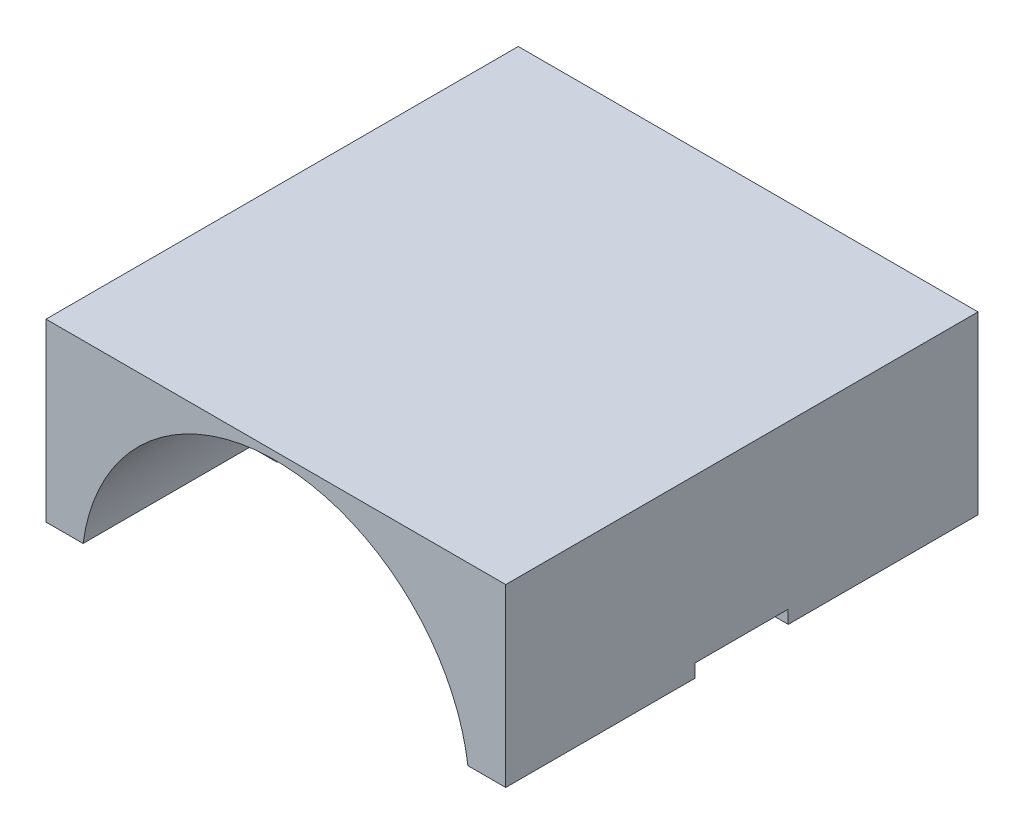
ISO-10303-21;
HEADER;
FILE_DESCRIPTION(('STEP AP214'),'2;1');
FILE_NAME('part.step','',(''),(''),'','','');
FILE_SCHEMA(('AUTOMOTIVE_DESIGN { 1 0 10303 214 1 1 1 1 }'));
ENDSEC;
DATA;
#1=APPLICATION_CONTEXT('core data for automotive mechanical design processes');
#2=APPLICATION_PROTOCOL_DEFINITION('international standard','automotive_design',2000,#1);
#3=PRODUCT_CONTEXT('',#1,'mechanical');
#4=PRODUCT('Part','Part','',(#3));
#5=PRODUCT_RELATED_PRODUCT_CATEGORY('part','',(#4));
#6=PRODUCT_DEFINITION_FORMATION('','',#4);
#7=PRODUCT_DEFINITION_CONTEXT('part definition',#1,'design');
#8=PRODUCT_DEFINITION('design','',#6,#7);
#9=PRODUCT_DEFINITION_SHAPE('','',#8);
#10=(LENGTH_UNIT() NAMED_UNIT(*) SI_UNIT(.MILLI.,.METRE.));
#11=(NAMED_UNIT(*) PLANE_ANGLE_UNIT() SI_UNIT($,.RADIAN.));
#12=(NAMED_UNIT(*) SI_UNIT($,.STERADIAN.) SOLID_ANGLE_UNIT());
#13=UNCERTAINTY_MEASURE_WITH_UNIT(LENGTH_MEASURE(1.E-05),#10,'distance_accuracy_value','');
#14=(GEOMETRIC_REPRESENTATION_CONTEXT(3) GLOBAL_UNCERTAINTY_ASSIGNED_CONTEXT((#13)) GLOBAL_UNIT_ASSIGNED_CONTEXT((#10,
#11,#12)) REPRESENTATION_CONTEXT('',''));
#15=CARTESIAN_POINT('',(0.,0.,0.));
#16=DIRECTION('',(0.,0.,1.));
#17=DIRECTION('',(1.,0.,0.));
#18=AXIS2_PLACEMENT_3D('',#15,#16,#17);
#19=CARTESIAN_POINT('',(-34.2277855679569,24.25,-40.4854368932039));
#20=DIRECTION('',(0.,1.,0.));
#21=DIRECTION('',(-1.,0.,0.));
#22=AXIS2_PLACEMENT_3D('',#19,#20,#21);
#23=PLANE('',#22);
#24=DIRECTION('',(0.,0.,-1.));
#25=VECTOR('',#24,1.);
#26=CARTESIAN_POINT('',(-15.8427724909354,24.25,3.56748567590681));
#27=LINE('',#26,#25);
#28=CARTESIAN_POINT('',(-15.8427724909354,24.25,-25.4854368932039));
#29=VERTEX_POINT('',#28);
#30=CARTESIAN_POINT('',(-15.8427724909354,24.25,-7.40382756529494));
#31=VERTEX_POINT('',#30);
#32=EDGE_CURVE('E178',#29,#31,#27,.F.);
#33=ORIENTED_EDGE('',*,*,#32,.T.);
#34=DIRECTION('',(-1.,0.,0.));
#35=VECTOR('',#34,1.);
#36=CARTESIAN_POINT('',(-34.2277855679569,24.25,-7.40382756529494));
#37=LINE('',#36,#35);
#38=CARTESIAN_POINT('',(-21.9027936314404,24.25,-7.40382756529494));
#39=VERTEX_POINT('',#38);
#40=EDGE_CURVE('E180',#31,#39,#37,.T.);
#41=ORIENTED_EDGE('',*,*,#40,.T.);
#42=DIRECTION('',(0.,0.,-1.));
#43=VECTOR('',#42,1.);
#44=CARTESIAN_POINT('',(-21.9027936314404,24.25,0.));
#45=LINE('',#44,#43);
#46=CARTESIAN_POINT('',(-21.9027936314404,24.25,-25.4854368932039));
#47=VERTEX_POINT('',#46);
#48=EDGE_CURVE('E185',#39,#47,#45,.T.);
#49=ORIENTED_EDGE('',*,*,#48,.T.);
#50=DIRECTION('',(-1.,0.,0.));
#51=VECTOR('',#50,1.);
#52=CARTESIAN_POINT('',(0.,24.25,-25.4854368932039));
#53=LINE('',#52,#51);
#54=EDGE_CURVE('E275',#29,#47,#53,.T.);
#55=ORIENTED_EDGE('',*,*,#54,.F.);
#56=EDGE_LOOP('',(#33,#41,#49,#55));
#57=FACE_BOUND('',#56,.T.);
#58=ADVANCED_FACE('F38',(#57),#23,.F.);
#59=DIRECTION('',(0.,0.,-1.));
#60=VECTOR('',#59,1.);
#61=CARTESIAN_POINT('',(15.7738641555528,24.25,3.56748567590681));
#62=LINE('',#61,#60);
#63=CARTESIAN_POINT('',(15.7738641555528,24.25,3.56748567590681));
#64=VERTEX_POINT('',#63);
#65=CARTESIAN_POINT('',(15.7738641555528,24.25,1.47192518337785));
#66=VERTEX_POINT('',#65);
#67=EDGE_CURVE('E42',#64,#66,#62,.T.);
#68=ORIENTED_EDGE('',*,*,#67,.T.);
#69=DIRECTION('',(1.,0.,0.));
#70=VECTOR('',#69,1.);
#71=CARTESIAN_POINT('',(-34.2277855679569,24.25,1.47192518337785));
#72=LINE('',#71,#70);
#73=CARTESIAN_POINT('',(21.9027936314404,24.25,1.47192518337784));
#74=VERTEX_POINT('',#73);
#75=EDGE_CURVE('E227',#66,#74,#72,.T.);
#76=ORIENTED_EDGE('',*,*,#75,.T.);
#77=DIRECTION('',(0.,0.,-1.));
#78=VECTOR('',#77,1.);
#79=CARTESIAN_POINT('',(21.9027936314404,24.25,0.));
#80=LINE('',#79,#78);
#81=CARTESIAN_POINT('',(21.9027936314404,24.25,19.5145631067961));
#82=VERTEX_POINT('',#81);
#83=EDGE_CURVE('E173',#82,#74,#80,.T.);
#84=ORIENTED_EDGE('',*,*,#83,.F.);
#85=DIRECTION('',(-1.,0.,0.));
#86=VECTOR('',#85,1.);
#87=CARTESIAN_POINT('',(-34.2277855679569,24.25,19.5145631067961));
#88=LINE('',#87,#86);
#89=CARTESIAN_POINT('',(18.3000195964781,24.25,19.5145631067961));
#90=VERTEX_POINT('',#89);
#91=EDGE_CURVE('E222',#82,#90,#88,.T.);
#92=ORIENTED_EDGE('',*,*,#91,.T.);
#93=DIRECTION('',(0.,0.,-1.));
#94=VECTOR('',#93,1.);
#95=CARTESIAN_POINT('',(18.3000195964781,24.25,28.5674856759068));
#96=LINE('',#95,#94);
#97=CARTESIAN_POINT('',(18.3000195964781,24.25,3.56748567590681));
#98=VERTEX_POINT('',#97);
#99=EDGE_CURVE('E226',#90,#98,#96,.T.);
#100=ORIENTED_EDGE('',*,*,#99,.T.);
#101=DIRECTION('',(-1.,0.,0.));
#102=VECTOR('',#101,1.);
#103=CARTESIAN_POINT('',(-0.0344541676912814,24.25,3.56748567590681));
#104=LINE('',#103,#102);
#105=EDGE_CURVE('E195',#98,#64,#104,.T.);
#106=ORIENTED_EDGE('',*,*,#105,.T.);
#107=EDGE_LOOP('',(#68,#76,#84,#92,#100,#106));
#108=FACE_BOUND('',#107,.T.);
#109=ADVANCED_FACE('F298',(#108),#23,.F.);
#110=CARTESIAN_POINT('',(21.9027936314404,24.25,-7.40382756529494));
#111=VERTEX_POINT('',#110);
#112=CARTESIAN_POINT('',(21.9027936314404,24.25,-25.4854368932039));
#113=VERTEX_POINT('',#112);
#114=EDGE_CURVE('E252',#111,#113,#80,.T.);
#115=ORIENTED_EDGE('',*,*,#114,.F.);
#116=DIRECTION('',(-1.,0.,0.));
#117=VECTOR('',#116,1.);
#118=CARTESIAN_POINT('',(-34.2277855679569,24.25,-7.40382756529494));
#119=LINE('',#118,#117);
#120=CARTESIAN_POINT('',(15.7738641555528,24.25,-7.40382756529494));
#121=VERTEX_POINT('',#120);
#122=EDGE_CURVE('E236',#111,#121,#119,.T.);
#123=ORIENTED_EDGE('',*,*,#122,.T.);
#124=CARTESIAN_POINT('',(15.7738641555528,24.25,-25.4854368932039));
#125=VERTEX_POINT('',#124);
#126=EDGE_CURVE('E234',#121,#125,#62,.T.);
#127=ORIENTED_EDGE('',*,*,#126,.T.);
#128=EDGE_CURVE('E255',#113,#125,#53,.T.);
#129=ORIENTED_EDGE('',*,*,#128,.F.);
#130=EDGE_LOOP('',(#115,#123,#127,#129));
#131=FACE_BOUND('',#130,.T.);
#132=ADVANCED_FACE('F304',(#131),#23,.F.);
#133=CARTESIAN_POINT('',(0.,41.,0.));
#134=DIRECTION('',(0.,1.,0.));
#135=DIRECTION('',(0.,0.,1.));
#136=AXIS2_PLACEMENT_3D('',#133,#134,#135);
#137=PLANE('',#136);
#138=DIRECTION('',(-1.,0.,0.));
#139=VECTOR('',#138,1.);
#140=CARTESIAN_POINT('',(21.9027936314404,41.,-25.4854368932039));
#141=LINE('',#140,#139);
#142=CARTESIAN_POINT('',(21.9027936314404,41.,-25.4854368932039));
#143=VERTEX_POINT('',#142);
#144=CARTESIAN_POINT('',(-21.9027936314404,41.,-25.4854368932039));
#145=VERTEX_POINT('',#144);
#146=EDGE_CURVE('E268',#143,#145,#141,.T.);
#147=ORIENTED_EDGE('',*,*,#146,.T.);
#148=DIRECTION('',(0.,0.,1.));
#149=VECTOR('',#148,1.);
#150=CARTESIAN_POINT('',(-21.9027936314404,41.,-25.4854368932039));
#151=LINE('',#150,#149);
#152=CARTESIAN_POINT('',(-21.9027936314404,41.,19.5145631067961));
#153=VERTEX_POINT('',#152);
#154=EDGE_CURVE('E265',#145,#153,#151,.T.);
#155=ORIENTED_EDGE('',*,*,#154,.T.);
#156=DIRECTION('',(1.,0.,0.));
#157=VECTOR('',#156,1.);
#158=CARTESIAN_POINT('',(-21.9027936314404,41.,19.5145631067961));
#159=LINE('',#158,#157);
#160=CARTESIAN_POINT('',(21.9027936314404,41.,19.5145631067961));
#161=VERTEX_POINT('',#160);
#162=EDGE_CURVE('E262',#153,#161,#159,.T.);
#163=ORIENTED_EDGE('',*,*,#162,.T.);
#164=DIRECTION('',(0.,0.,-1.));
#165=VECTOR('',#164,1.);
#166=CARTESIAN_POINT('',(21.9027936314404,41.,19.5145631067961));
#167=LINE('',#166,#165);
#168=EDGE_CURVE('E258',#161,#143,#167,.T.);
#169=ORIENTED_EDGE('',*,*,#168,.T.);
#170=EDGE_LOOP('',(#147,#155,#163,#169));
#171=FACE_BOUND('',#170,.T.);
#172=ADVANCED_FACE('F318',(#171),#137,.T.);
#173=CARTESIAN_POINT('',(-0.0344541676912807,21.7807750626998,3.56748567590681));
#174=DIRECTION('',(0.,0.,1.));
#175=DIRECTION('',(1.,0.,0.));
#176=AXIS2_PLACEMENT_3D('',#173,#174,#175);
#177=PLANE('',#176);
#178=ORIENTED_EDGE('',*,*,#105,.F.);
#179=CARTESIAN_POINT('',(-0.0344541676912807,21.7807750626998,3.56748567590681));
#180=DIRECTION('',(0.,0.,1.));
#181=DIRECTION('',(1.,0.,0.));
#182=AXIS2_PLACEMENT_3D('',#179,#180,#181);
#183=CIRCLE('',#182,18.5);
#184=CARTESIAN_POINT('',(-18.3689279318606,24.25,3.56748567590681));
#185=VERTEX_POINT('',#184);
#186=EDGE_CURVE('E261',#98,#185,#183,.T.);
#187=ORIENTED_EDGE('',*,*,#186,.T.);
#188=CARTESIAN_POINT('',(-15.8427724909354,24.25,3.56748567590681));
#189=VERTEX_POINT('',#188);
#190=EDGE_CURVE('E187',#189,#185,#104,.T.);
#191=ORIENTED_EDGE('',*,*,#190,.F.);
#192=CARTESIAN_POINT('',(-0.0344541676912807,21.7807750626998,3.56748567590681));
#193=DIRECTION('',(0.,0.,1.));
#194=DIRECTION('',(1.,0.,0.));
#195=AXIS2_PLACEMENT_3D('',#192,#193,#194);
#196=CIRCLE('',#195,16.);
#197=EDGE_CURVE('E246',#64,#189,#196,.T.);
#198=ORIENTED_EDGE('',*,*,#197,.F.);
#199=EDGE_LOOP('',(#178,#187,#191,#198));
#200=FACE_BOUND('',#199,.T.);
#201=ADVANCED_FACE('F323',(#200),#177,.T.);
#202=CARTESIAN_POINT('',(-0.0344541676912807,21.7807750626998,3.56748567590681));
#203=DIRECTION('',(0.,0.,-1.));
#204=DIRECTION('',(-1.,0.,0.));
#205=AXIS2_PLACEMENT_3D('',#202,#203,#204);
#206=CYLINDRICAL_SURFACE('',#205,16.);
#207=CARTESIAN_POINT('',(-0.0344541676912807,21.7807750626998,-7.40382756529494));
#208=DIRECTION('',(0.,0.,-1.));
#209=DIRECTION('',(-1.,0.,0.));
#210=AXIS2_PLACEMENT_3D('',#207,#208,#209);
#211=CIRCLE('',#210,16.);
#212=CARTESIAN_POINT('',(15.5248800522237,25.51,-7.40382756529494));
#213=VERTEX_POINT('',#212);
#214=EDGE_CURVE('E205',#213,#121,#211,.T.);
#215=ORIENTED_EDGE('',*,*,#214,.F.);
#216=DIRECTION('',(0.,0.,-1.));
#217=VECTOR('',#216,1.);
#218=CARTESIAN_POINT('',(15.5248800522237,25.51,3.56748567590681));
#219=LINE('',#218,#217);
#220=CARTESIAN_POINT('',(15.5248800522237,25.51,1.47192518337784));
#221=VERTEX_POINT('',#220);
#222=EDGE_CURVE('E94',#221,#213,#219,.T.);
#223=ORIENTED_EDGE('',*,*,#222,.F.);
#224=CARTESIAN_POINT('',(-0.0344541676912807,21.7807750626998,1.47192518337784));
#225=DIRECTION('',(0.,0.,1.));
#226=DIRECTION('',(1.,0.,0.));
#227=AXIS2_PLACEMENT_3D('',#224,#225,#226);
#228=CIRCLE('',#227,16.);
#229=EDGE_CURVE('E160',#66,#221,#228,.T.);
#230=ORIENTED_EDGE('',*,*,#229,.F.);
#231=ORIENTED_EDGE('',*,*,#67,.F.);
#232=ORIENTED_EDGE('',*,*,#197,.T.);
#233=CARTESIAN_POINT('',(-15.8427724909354,24.25,1.47192518337785));
#234=VERTEX_POINT('',#233);
#235=EDGE_CURVE('E181',#234,#189,#27,.F.);
#236=ORIENTED_EDGE('',*,*,#235,.F.);
#237=CARTESIAN_POINT('',(-15.5937883876063,25.51,1.47192518337784));
#238=VERTEX_POINT('',#237);
#239=EDGE_CURVE('E168',#238,#234,#228,.T.);
#240=ORIENTED_EDGE('',*,*,#239,.F.);
#241=DIRECTION('',(0.,0.,-1.));
#242=VECTOR('',#241,1.);
#243=CARTESIAN_POINT('',(-15.5937883876063,25.51,3.56748567590681));
#244=LINE('',#243,#242);
#245=CARTESIAN_POINT('',(-15.5937883876063,25.51,-7.40382756529494));
#246=VERTEX_POINT('',#245);
#247=EDGE_CURVE('E215',#246,#238,#244,.F.);
#248=ORIENTED_EDGE('',*,*,#247,.F.);
#249=EDGE_CURVE('E210',#31,#246,#211,.T.);
#250=ORIENTED_EDGE('',*,*,#249,.F.);
#251=ORIENTED_EDGE('',*,*,#32,.F.);
#252=CARTESIAN_POINT('',(-0.0344541676912807,21.7807750626998,-25.4854368932039));
#253=DIRECTION('',(0.,0.,1.));
#254=DIRECTION('',(1.,0.,0.));
#255=AXIS2_PLACEMENT_3D('',#252,#253,#254);
#256=CIRCLE('',#255,16.);
#257=EDGE_CURVE('E243',#29,#125,#256,.F.);
#258=ORIENTED_EDGE('',*,*,#257,.T.);
#259=ORIENTED_EDGE('',*,*,#126,.F.);
#260=EDGE_LOOP('',(#215,#223,#230,#231,#232,#236,#240,#248,#250,#251,#258,#259));
#261=FACE_BOUND('',#260,.T.);
#262=ADVANCED_FACE('F40',(#261),#206,.F.);
#263=CARTESIAN_POINT('',(-0.0344541676912807,21.7807750626998,28.5674856759068));
#264=DIRECTION('',(0.,0.,-1.));
#265=DIRECTION('',(-1.,0.,0.));
#266=AXIS2_PLACEMENT_3D('',#263,#264,#265);
#267=CYLINDRICAL_SURFACE('',#266,18.5);
#268=ORIENTED_EDGE('',*,*,#99,.F.);
#269=CARTESIAN_POINT('',(-0.0344541676912807,21.7807750626998,19.5145631067961));
#270=DIRECTION('',(0.,0.,-1.));
#271=DIRECTION('',(-1.,0.,0.));
#272=AXIS2_PLACEMENT_3D('',#269,#270,#271);
#273=CIRCLE('',#272,18.5);
#274=CARTESIAN_POINT('',(-18.3689279318606,24.25,19.5145631067961));
#275=VERTEX_POINT('',#274);
#276=EDGE_CURVE('E239',#90,#275,#273,.F.);
#277=ORIENTED_EDGE('',*,*,#276,.T.);
#278=DIRECTION('',(0.,0.,-1.));
#279=VECTOR('',#278,1.);
#280=CARTESIAN_POINT('',(-18.3689279318606,24.25,28.5674856759068));
#281=LINE('',#280,#279);
#282=EDGE_CURVE('E193',#185,#275,#281,.F.);
#283=ORIENTED_EDGE('',*,*,#282,.F.);
#284=ORIENTED_EDGE('',*,*,#186,.F.);
#285=EDGE_LOOP('',(#268,#277,#283,#284));
#286=FACE_BOUND('',#285,.T.);
#287=ADVANCED_FACE('F334',(#286),#267,.F.);
#288=CARTESIAN_POINT('',(0.,25.,-25.4854368932039));
#289=DIRECTION('',(0.,0.,1.));
#290=DIRECTION('',(1.,0.,0.));
#291=AXIS2_PLACEMENT_3D('',#288,#289,#290);
#292=PLANE('',#291);
#293=DIRECTION('',(0.,-1.,0.));
#294=VECTOR('',#293,1.);
#295=CARTESIAN_POINT('',(21.9027936314404,25.,-25.4854368932039));
#296=LINE('',#295,#294);
#297=EDGE_CURVE('E242',#143,#113,#296,.T.);
#298=ORIENTED_EDGE('',*,*,#297,.T.);
#299=ORIENTED_EDGE('',*,*,#128,.T.);
#300=ORIENTED_EDGE('',*,*,#257,.F.);
#301=ORIENTED_EDGE('',*,*,#54,.T.);
#302=DIRECTION('',(0.,-1.,0.));
#303=VECTOR('',#302,1.);
#304=CARTESIAN_POINT('',(-21.9027936314404,25.,-25.4854368932039));
#305=LINE('',#304,#303);
#306=EDGE_CURVE('E249',#145,#47,#305,.T.);
#307=ORIENTED_EDGE('',*,*,#306,.F.);
#308=ORIENTED_EDGE('',*,*,#146,.F.);
#309=EDGE_LOOP('',(#298,#299,#300,#301,#307,#308));
#310=FACE_BOUND('',#309,.T.);
#311=ADVANCED_FACE('F282',(#310),#292,.F.);
#312=CARTESIAN_POINT('',(21.9027936314404,25.,0.));
#313=DIRECTION('',(-1.,0.,0.));
#314=DIRECTION('',(0.,0.,1.));
#315=AXIS2_PLACEMENT_3D('',#312,#313,#314);
#316=PLANE('',#315);
#317=DIRECTION('',(0.,0.,1.));
#318=VECTOR('',#317,1.);
#319=CARTESIAN_POINT('',(21.9027936314404,25.51,0.));
#320=LINE('',#319,#318);
#321=CARTESIAN_POINT('',(21.9027936314404,25.51,-7.40382756529494));
#322=VERTEX_POINT('',#321);
#323=CARTESIAN_POINT('',(21.9027936314404,25.51,1.47192518337784));
#324=VERTEX_POINT('',#323);
#325=EDGE_CURVE('E164',#322,#324,#320,.T.);
#326=ORIENTED_EDGE('',*,*,#325,.F.);
#327=DIRECTION('',(0.,1.,0.));
#328=VECTOR('',#327,1.);
#329=CARTESIAN_POINT('',(21.9027936314404,0.,-7.40382756529494));
#330=LINE('',#329,#328);
#331=EDGE_CURVE('E177',#111,#322,#330,.T.);
#332=ORIENTED_EDGE('',*,*,#331,.F.);
#333=ORIENTED_EDGE('',*,*,#114,.T.);
#334=ORIENTED_EDGE('',*,*,#297,.F.);
#335=ORIENTED_EDGE('',*,*,#168,.F.);
#336=DIRECTION('',(0.,-1.,0.));
#337=VECTOR('',#336,1.);
#338=CARTESIAN_POINT('',(21.9027936314404,25.,19.5145631067961));
#339=LINE('',#338,#337);
#340=EDGE_CURVE('E250',#161,#82,#339,.T.);
#341=ORIENTED_EDGE('',*,*,#340,.T.);
#342=ORIENTED_EDGE('',*,*,#83,.T.);
#343=DIRECTION('',(0.,-1.,0.));
#344=VECTOR('',#343,1.);
#345=CARTESIAN_POINT('',(21.9027936314404,0.,1.47192518337784));
#346=LINE('',#345,#344);
#347=EDGE_CURVE('E155',#324,#74,#346,.T.);
#348=ORIENTED_EDGE('',*,*,#347,.F.);
#349=EDGE_LOOP('',(#326,#332,#333,#334,#335,#341,#342,#348));
#350=FACE_BOUND('',#349,.T.);
#351=ADVANCED_FACE('F171',(#350),#316,.F.);
#352=CARTESIAN_POINT('',(-21.9027936314404,25.,0.));
#353=DIRECTION('',(-1.,0.,0.));
#354=DIRECTION('',(0.,0.,1.));
#355=AXIS2_PLACEMENT_3D('',#352,#353,#354);
#356=PLANE('',#355);
#357=DIRECTION('',(0.,-1.,0.));
#358=VECTOR('',#357,1.);
#359=CARTESIAN_POINT('',(-21.9027936314404,25.,-7.40382756529494));
#360=LINE('',#359,#358);
#361=CARTESIAN_POINT('',(-21.9027936314404,25.51,-7.40382756529494));
#362=VERTEX_POINT('',#361);
#363=EDGE_CURVE('E212',#362,#39,#360,.T.);
#364=ORIENTED_EDGE('',*,*,#363,.F.);
#365=DIRECTION('',(0.,0.,-1.));
#366=VECTOR('',#365,1.);
#367=CARTESIAN_POINT('',(-21.9027936314404,25.51,0.));
#368=LINE('',#367,#366);
#369=CARTESIAN_POINT('',(-21.9027936314404,25.51,1.47192518337784));
#370=VERTEX_POINT('',#369);
#371=EDGE_CURVE('E48',#370,#362,#368,.T.);
#372=ORIENTED_EDGE('',*,*,#371,.F.);
#373=DIRECTION('',(0.,1.,0.));
#374=VECTOR('',#373,1.);
#375=CARTESIAN_POINT('',(-21.9027936314404,25.,1.47192518337784));
#376=LINE('',#375,#374);
#377=CARTESIAN_POINT('',(-21.9027936314475,24.25,1.47192518337785));
#378=VERTEX_POINT('',#377);
#379=EDGE_CURVE('E203',#378,#370,#376,.T.);
#380=ORIENTED_EDGE('',*,*,#379,.F.);
#381=CARTESIAN_POINT('',(-21.9027936314404,24.25,19.5145631067961));
#382=VERTEX_POINT('',#381);
#383=EDGE_CURVE('E196',#382,#378,#45,.T.);
#384=ORIENTED_EDGE('',*,*,#383,.F.);
#385=DIRECTION('',(0.,-1.,0.));
#386=VECTOR('',#385,1.);
#387=CARTESIAN_POINT('',(-21.9027936314404,25.,19.5145631067961));
#388=LINE('',#387,#386);
#389=EDGE_CURVE('E199',#153,#382,#388,.T.);
#390=ORIENTED_EDGE('',*,*,#389,.F.);
#391=ORIENTED_EDGE('',*,*,#154,.F.);
#392=ORIENTED_EDGE('',*,*,#306,.T.);
#393=ORIENTED_EDGE('',*,*,#48,.F.);
#394=EDGE_LOOP('',(#364,#372,#380,#384,#390,#391,#392,#393));
#395=FACE_BOUND('',#394,.T.);
#396=ADVANCED_FACE('F295',(#395),#356,.T.);
#397=CARTESIAN_POINT('',(-32.0388349514563,5.,19.5145631067961));
#398=DIRECTION('',(0.,0.,-1.));
#399=DIRECTION('',(-1.,0.,0.));
#400=AXIS2_PLACEMENT_3D('',#397,#398,#399);
#401=PLANE('',#400);
#402=ORIENTED_EDGE('',*,*,#389,.T.);
#403=EDGE_CURVE('E217',#275,#382,#88,.T.);
#404=ORIENTED_EDGE('',*,*,#403,.F.);
#405=ORIENTED_EDGE('',*,*,#276,.F.);
#406=ORIENTED_EDGE('',*,*,#91,.F.);
#407=ORIENTED_EDGE('',*,*,#340,.F.);
#408=ORIENTED_EDGE('',*,*,#162,.F.);
#409=EDGE_LOOP('',(#402,#404,#405,#406,#407,#408));
#410=FACE_BOUND('',#409,.T.);
#411=ADVANCED_FACE('F308',(#410),#401,.F.);
#412=ORIENTED_EDGE('',*,*,#383,.T.);
#413=DIRECTION('',(1.,0.,0.));
#414=VECTOR('',#413,1.);
#415=CARTESIAN_POINT('',(-34.2277855679569,24.25,1.47192518337785));
#416=LINE('',#415,#414);
#417=EDGE_CURVE('E188',#378,#234,#416,.T.);
#418=ORIENTED_EDGE('',*,*,#417,.T.);
#419=ORIENTED_EDGE('',*,*,#235,.T.);
#420=ORIENTED_EDGE('',*,*,#190,.T.);
#421=ORIENTED_EDGE('',*,*,#282,.T.);
#422=ORIENTED_EDGE('',*,*,#403,.T.);
#423=EDGE_LOOP('',(#412,#418,#419,#420,#421,#422));
#424=FACE_BOUND('',#423,.T.);
#425=ADVANCED_FACE('F299',(#424),#23,.F.);
#426=CARTESIAN_POINT('',(-32.0388349514563,0.,-7.40382756529494));
#427=DIRECTION('',(0.,0.,-1.));
#428=DIRECTION('',(-1.,0.,0.));
#429=AXIS2_PLACEMENT_3D('',#426,#427,#428);
#430=PLANE('',#429);
#431=ORIENTED_EDGE('',*,*,#214,.T.);
#432=ORIENTED_EDGE('',*,*,#122,.F.);
#433=ORIENTED_EDGE('',*,*,#331,.T.);
#434=DIRECTION('',(1.,0.,0.));
#435=VECTOR('',#434,1.);
#436=CARTESIAN_POINT('',(-32.0388349514563,25.51,-7.40382756529494));
#437=LINE('',#436,#435);
#438=EDGE_CURVE('E50',#213,#322,#437,.T.);
#439=ORIENTED_EDGE('',*,*,#438,.F.);
#440=EDGE_LOOP('',(#431,#432,#433,#439));
#441=FACE_BOUND('',#440,.T.);
#442=ADVANCED_FACE('F307',(#441),#430,.F.);
#443=CARTESIAN_POINT('',(-32.0388349514563,0.,1.47192518337784));
#444=DIRECTION('',(0.,0.,1.));
#445=DIRECTION('',(1.,0.,0.));
#446=AXIS2_PLACEMENT_3D('',#443,#444,#445);
#447=PLANE('',#446);
#448=ORIENTED_EDGE('',*,*,#229,.T.);
#449=DIRECTION('',(1.,0.,0.));
#450=VECTOR('',#449,1.);
#451=CARTESIAN_POINT('',(-32.0388349514563,25.51,1.47192518337784));
#452=LINE('',#451,#450);
#453=EDGE_CURVE('E157',#221,#324,#452,.T.);
#454=ORIENTED_EDGE('',*,*,#453,.T.);
#455=ORIENTED_EDGE('',*,*,#347,.T.);
#456=ORIENTED_EDGE('',*,*,#75,.F.);
#457=EDGE_LOOP('',(#448,#454,#455,#456));
#458=FACE_BOUND('',#457,.T.);
#459=ADVANCED_FACE('F158',(#458),#447,.F.);
#460=CARTESIAN_POINT('',(-32.0388349514563,25.51,0.));
#461=DIRECTION('',(0.,1.,0.));
#462=DIRECTION('',(0.,0.,1.));
#463=AXIS2_PLACEMENT_3D('',#460,#461,#462);
#464=PLANE('',#463);
#465=ORIENTED_EDGE('',*,*,#222,.T.);
#466=ORIENTED_EDGE('',*,*,#438,.T.);
#467=ORIENTED_EDGE('',*,*,#325,.T.);
#468=ORIENTED_EDGE('',*,*,#453,.F.);
#469=EDGE_LOOP('',(#465,#466,#467,#468));
#470=FACE_BOUND('',#469,.T.);
#471=ADVANCED_FACE('F165',(#470),#464,.F.);
#472=ORIENTED_EDGE('',*,*,#239,.T.);
#473=ORIENTED_EDGE('',*,*,#417,.F.);
#474=ORIENTED_EDGE('',*,*,#379,.T.);
#475=EDGE_CURVE('E162',#370,#238,#452,.T.);
#476=ORIENTED_EDGE('',*,*,#475,.T.);
#477=EDGE_LOOP('',(#472,#473,#474,#476));
#478=FACE_BOUND('',#477,.T.);
#479=ADVANCED_FACE('F352',(#478),#447,.F.);
#480=ORIENTED_EDGE('',*,*,#249,.T.);
#481=EDGE_CURVE('E11',#362,#246,#437,.T.);
#482=ORIENTED_EDGE('',*,*,#481,.F.);
#483=ORIENTED_EDGE('',*,*,#363,.T.);
#484=ORIENTED_EDGE('',*,*,#40,.F.);
#485=EDGE_LOOP('',(#480,#482,#483,#484));
#486=FACE_BOUND('',#485,.T.);
#487=ADVANCED_FACE('F292',(#486),#430,.F.);
#488=ORIENTED_EDGE('',*,*,#247,.T.);
#489=ORIENTED_EDGE('',*,*,#475,.F.);
#490=ORIENTED_EDGE('',*,*,#371,.T.);
#491=ORIENTED_EDGE('',*,*,#481,.T.);
#492=EDGE_LOOP('',(#488,#489,#490,#491));
#493=FACE_BOUND('',#492,.T.);
#494=ADVANCED_FACE('F290',(#493),#464,.F.);
#495=CLOSED_SHELL('',(#58,#109,#132,#172,#201,#262,#287,#311,#351,#396,#411,#425,#442,#459,#471,
#479,#487,#494));
#496=MANIFOLD_SOLID_BREP('B2',#495);
#497=ADVANCED_BREP_SHAPE_REPRESENTATION('',(#18,#496),#14);
#498=SHAPE_DEFINITION_REPRESENTATION(#9,#497);
ENDSEC;
END-ISO-10303-21;
